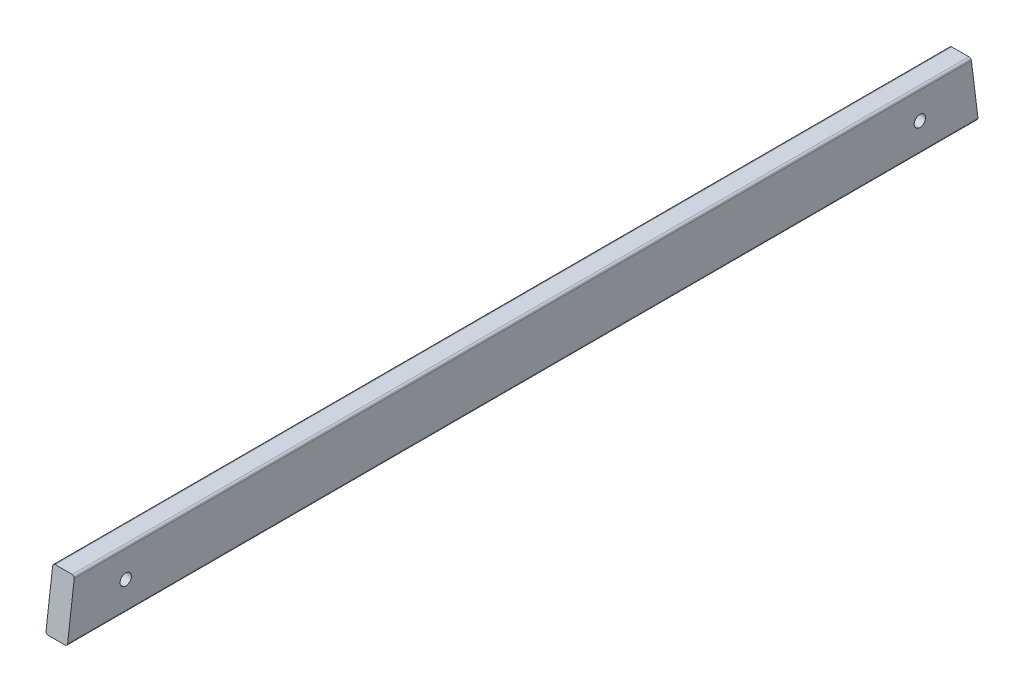
ISO-10303-21;
HEADER;
FILE_DESCRIPTION(('STEP AP214'),'2;1');
FILE_NAME('part.step','',(''),(''),'','','');
FILE_SCHEMA(('AUTOMOTIVE_DESIGN { 1 0 10303 214 1 1 1 1 }'));
ENDSEC;
DATA;
#1=APPLICATION_CONTEXT('core data for automotive mechanical design processes');
#2=APPLICATION_PROTOCOL_DEFINITION('international standard','automotive_design',2000,#1);
#3=PRODUCT_CONTEXT('',#1,'mechanical');
#4=PRODUCT('Part','Part','',(#3));
#5=PRODUCT_RELATED_PRODUCT_CATEGORY('part','',(#4));
#6=PRODUCT_DEFINITION_FORMATION('','',#4);
#7=PRODUCT_DEFINITION_CONTEXT('part definition',#1,'design');
#8=PRODUCT_DEFINITION('design','',#6,#7);
#9=PRODUCT_DEFINITION_SHAPE('','',#8);
#10=(LENGTH_UNIT() NAMED_UNIT(*) SI_UNIT(.MILLI.,.METRE.));
#11=(NAMED_UNIT(*) PLANE_ANGLE_UNIT() SI_UNIT($,.RADIAN.));
#12=(NAMED_UNIT(*) SI_UNIT($,.STERADIAN.) SOLID_ANGLE_UNIT());
#13=UNCERTAINTY_MEASURE_WITH_UNIT(LENGTH_MEASURE(1.E-05),#10,'distance_accuracy_value','');
#14=(GEOMETRIC_REPRESENTATION_CONTEXT(3) GLOBAL_UNCERTAINTY_ASSIGNED_CONTEXT((#13)) GLOBAL_UNIT_ASSIGNED_CONTEXT((#10,
#11,#12)) REPRESENTATION_CONTEXT('',''));
#15=CARTESIAN_POINT('',(0.,0.,0.));
#16=DIRECTION('',(0.,0.,1.));
#17=DIRECTION('',(1.,0.,0.));
#18=AXIS2_PLACEMENT_3D('',#15,#16,#17);
#19=CARTESIAN_POINT('',(4.7625,-12.7,210.));
#20=DIRECTION('',(-1.,0.,0.));
#21=DIRECTION('',(0.,0.,1.));
#22=AXIS2_PLACEMENT_3D('',#19,#20,#21);
#23=PLANE('',#22);
#24=CARTESIAN_POINT('',(4.7625,0.,-175.));
#25=DIRECTION('',(-1.,0.,0.));
#26=DIRECTION('',(0.,0.,1.));
#27=AXIS2_PLACEMENT_3D('',#24,#25,#26);
#28=CIRCLE('',#27,2.5);
#29=CARTESIAN_POINT('',(4.7625,0.,-172.5));
#30=VERTEX_POINT('',#29);
#31=EDGE_CURVE('E333',#30,#30,#28,.T.);
#32=ORIENTED_EDGE('',*,*,#31,.T.);
#33=EDGE_LOOP('',(#32));
#34=FACE_BOUND('',#33,.T.);
#35=CARTESIAN_POINT('',(4.7625,0.,175.));
#36=DIRECTION('',(-1.,0.,0.));
#37=DIRECTION('',(0.,0.,1.));
#38=AXIS2_PLACEMENT_3D('',#35,#36,#37);
#39=CIRCLE('',#38,2.5);
#40=CARTESIAN_POINT('',(4.7625,0.,177.5));
#41=VERTEX_POINT('',#40);
#42=EDGE_CURVE('E212',#41,#41,#39,.T.);
#43=ORIENTED_EDGE('',*,*,#42,.T.);
#44=EDGE_LOOP('',(#43));
#45=FACE_BOUND('',#44,.T.);
#46=DIRECTION('',(0.,-0.992433566496753,-0.122782800467067));
#47=VECTOR('',#46,1.);
#48=CARTESIAN_POINT('',(4.7625,-12.7,-200.73));
#49=LINE('',#48,#47);
#50=CARTESIAN_POINT('',(4.7625,11.7,-197.711258562251));
#51=VERTEX_POINT('',#50);
#52=CARTESIAN_POINT('',(4.7625,-11.7,-200.606281088617));
#53=VERTEX_POINT('',#52);
#54=EDGE_CURVE('E123',#51,#53,#49,.T.);
#55=ORIENTED_EDGE('',*,*,#54,.F.);
#56=DIRECTION('',(0.,0.,-1.));
#57=VECTOR('',#56,1.);
#58=CARTESIAN_POINT('',(4.7625,11.7,210.));
#59=LINE('',#58,#57);
#60=CARTESIAN_POINT('',(4.7625,11.7,197.711258562251));
#61=VERTEX_POINT('',#60);
#62=EDGE_CURVE('E178',#51,#61,#59,.F.);
#63=ORIENTED_EDGE('',*,*,#62,.T.);
#64=DIRECTION('',(0.,0.992433566496753,-0.122782800467067));
#65=VECTOR('',#64,1.);
#66=CARTESIAN_POINT('',(4.7625,642.333245071398,119.69));
#67=LINE('',#66,#65);
#68=CARTESIAN_POINT('',(4.7625,-11.7,200.606281088617));
#69=VERTEX_POINT('',#68);
#70=EDGE_CURVE('E199',#69,#61,#67,.T.);
#71=ORIENTED_EDGE('',*,*,#70,.F.);
#72=DIRECTION('',(0.,0.,-1.));
#73=VECTOR('',#72,1.);
#74=CARTESIAN_POINT('',(4.7625,-11.7,210.));
#75=LINE('',#74,#73);
#76=EDGE_CURVE('E182',#69,#53,#75,.T.);
#77=ORIENTED_EDGE('',*,*,#76,.T.);
#78=EDGE_LOOP('',(#55,#63,#71,#77));
#79=FACE_BOUND('',#78,.T.);
#80=ADVANCED_FACE('F41',(#34,#45,#79),#23,.F.);
#81=CARTESIAN_POINT('',(-4.7625,12.7,210.));
#82=DIRECTION('',(0.,-1.,0.));
#83=DIRECTION('',(0.,0.,-1.));
#84=AXIS2_PLACEMENT_3D('',#81,#82,#83);
#85=PLANE('',#84);
#86=DIRECTION('',(1.,0.,0.));
#87=VECTOR('',#86,1.);
#88=CARTESIAN_POINT('',(-4.7625,12.7,-197.587539650868));
#89=LINE('',#88,#87);
#90=CARTESIAN_POINT('',(-3.7625,12.7,-197.587539650868));
#91=VERTEX_POINT('',#90);
#92=CARTESIAN_POINT('',(3.7625,12.7,-197.587539650868));
#93=VERTEX_POINT('',#92);
#94=EDGE_CURVE('E163',#91,#93,#89,.T.);
#95=ORIENTED_EDGE('',*,*,#94,.F.);
#96=DIRECTION('',(0.,0.,-1.));
#97=VECTOR('',#96,1.);
#98=CARTESIAN_POINT('',(-3.7625,12.7,210.));
#99=LINE('',#98,#97);
#100=CARTESIAN_POINT('',(-3.7625,12.7,197.587539650868));
#101=VERTEX_POINT('',#100);
#102=EDGE_CURVE('E139',#91,#101,#99,.F.);
#103=ORIENTED_EDGE('',*,*,#102,.T.);
#104=DIRECTION('',(-1.,0.,0.));
#105=VECTOR('',#104,1.);
#106=CARTESIAN_POINT('',(-4.7625,12.7,197.587539650868));
#107=LINE('',#106,#105);
#108=CARTESIAN_POINT('',(3.7625,12.7,197.587539650868));
#109=VERTEX_POINT('',#108);
#110=EDGE_CURVE('E66',#109,#101,#107,.T.);
#111=ORIENTED_EDGE('',*,*,#110,.F.);
#112=DIRECTION('',(0.,0.,-1.));
#113=VECTOR('',#112,1.);
#114=CARTESIAN_POINT('',(3.7625,12.7,210.));
#115=LINE('',#114,#113);
#116=EDGE_CURVE('E146',#109,#93,#115,.T.);
#117=ORIENTED_EDGE('',*,*,#116,.T.);
#118=EDGE_LOOP('',(#95,#103,#111,#117));
#119=FACE_BOUND('',#118,.T.);
#120=ADVANCED_FACE('F161',(#119),#85,.F.);
#121=CARTESIAN_POINT('',(-4.7625,-12.7,210.));
#122=DIRECTION('',(1.,0.,0.));
#123=DIRECTION('',(0.,0.,-1.));
#124=AXIS2_PLACEMENT_3D('',#121,#122,#123);
#125=PLANE('',#124);
#126=CARTESIAN_POINT('',(-4.7625,0.,-175.));
#127=DIRECTION('',(-1.,0.,0.));
#128=DIRECTION('',(0.,0.,1.));
#129=AXIS2_PLACEMENT_3D('',#126,#127,#128);
#130=CIRCLE('',#129,2.5);
#131=CARTESIAN_POINT('',(-4.7625,0.,-172.5));
#132=VERTEX_POINT('',#131);
#133=EDGE_CURVE('E336',#132,#132,#130,.T.);
#134=ORIENTED_EDGE('',*,*,#133,.F.);
#135=EDGE_LOOP('',(#134));
#136=FACE_BOUND('',#135,.T.);
#137=CARTESIAN_POINT('',(-4.7625,0.,175.));
#138=DIRECTION('',(-1.,0.,0.));
#139=DIRECTION('',(0.,0.,1.));
#140=AXIS2_PLACEMENT_3D('',#137,#138,#139);
#141=CIRCLE('',#140,2.5);
#142=CARTESIAN_POINT('',(-4.7625,0.,177.5));
#143=VERTEX_POINT('',#142);
#144=EDGE_CURVE('E340',#143,#143,#141,.T.);
#145=ORIENTED_EDGE('',*,*,#144,.F.);
#146=EDGE_LOOP('',(#145));
#147=FACE_BOUND('',#146,.T.);
#148=DIRECTION('',(0.,-0.992433566496753,-0.122782800467067));
#149=VECTOR('',#148,1.);
#150=CARTESIAN_POINT('',(-4.7625,-12.7,-200.73));
#151=LINE('',#150,#149);
#152=CARTESIAN_POINT('',(-4.7625,11.7,-197.711258562251));
#153=VERTEX_POINT('',#152);
#154=CARTESIAN_POINT('',(-4.7625,-11.7,-200.606281088617));
#155=VERTEX_POINT('',#154);
#156=EDGE_CURVE('E56',#153,#155,#151,.T.);
#157=ORIENTED_EDGE('',*,*,#156,.T.);
#158=DIRECTION('',(0.,0.,-1.));
#159=VECTOR('',#158,1.);
#160=CARTESIAN_POINT('',(-4.7625,-11.7,210.));
#161=LINE('',#160,#159);
#162=CARTESIAN_POINT('',(-4.7625,-11.7,200.606281088617));
#163=VERTEX_POINT('',#162);
#164=EDGE_CURVE('E130',#155,#163,#161,.F.);
#165=ORIENTED_EDGE('',*,*,#164,.T.);
#166=DIRECTION('',(0.,0.992433566496753,-0.122782800467067));
#167=VECTOR('',#166,1.);
#168=CARTESIAN_POINT('',(-4.7625,642.333245071398,119.69));
#169=LINE('',#168,#167);
#170=CARTESIAN_POINT('',(-4.7625,11.7,197.711258562251));
#171=VERTEX_POINT('',#170);
#172=EDGE_CURVE('E113',#163,#171,#169,.T.);
#173=ORIENTED_EDGE('',*,*,#172,.T.);
#174=DIRECTION('',(0.,0.,-1.));
#175=VECTOR('',#174,1.);
#176=CARTESIAN_POINT('',(-4.7625,11.7,210.));
#177=LINE('',#176,#175);
#178=EDGE_CURVE('E140',#171,#153,#177,.T.);
#179=ORIENTED_EDGE('',*,*,#178,.T.);
#180=EDGE_LOOP('',(#157,#165,#173,#179));
#181=FACE_BOUND('',#180,.T.);
#182=ADVANCED_FACE('F137',(#136,#147,#181),#125,.F.);
#183=CARTESIAN_POINT('',(-4.7625,-12.7,210.));
#184=DIRECTION('',(0.,1.,0.));
#185=DIRECTION('',(0.,0.,1.));
#186=AXIS2_PLACEMENT_3D('',#183,#184,#185);
#187=PLANE('',#186);
#188=DIRECTION('',(-1.,0.,0.));
#189=VECTOR('',#188,1.);
#190=CARTESIAN_POINT('',(4.7625,-12.7,-200.73));
#191=LINE('',#190,#189);
#192=CARTESIAN_POINT('',(3.7625,-12.7,-200.73));
#193=VERTEX_POINT('',#192);
#194=CARTESIAN_POINT('',(-3.7625,-12.7,-200.73));
#195=VERTEX_POINT('',#194);
#196=EDGE_CURVE('E194',#193,#195,#191,.T.);
#197=ORIENTED_EDGE('',*,*,#196,.F.);
#198=DIRECTION('',(0.,0.,-1.));
#199=VECTOR('',#198,1.);
#200=CARTESIAN_POINT('',(3.7625,-12.7,210.));
#201=LINE('',#200,#199);
#202=CARTESIAN_POINT('',(3.7625,-12.7,200.73));
#203=VERTEX_POINT('',#202);
#204=EDGE_CURVE('E149',#193,#203,#201,.F.);
#205=ORIENTED_EDGE('',*,*,#204,.T.);
#206=DIRECTION('',(-1.,0.,0.));
#207=VECTOR('',#206,1.);
#208=CARTESIAN_POINT('',(4.7625,-12.7,200.73));
#209=LINE('',#208,#207);
#210=CARTESIAN_POINT('',(-3.7625,-12.7,200.73));
#211=VERTEX_POINT('',#210);
#212=EDGE_CURVE('E193',#203,#211,#209,.T.);
#213=ORIENTED_EDGE('',*,*,#212,.T.);
#214=DIRECTION('',(0.,0.,-1.));
#215=VECTOR('',#214,1.);
#216=CARTESIAN_POINT('',(-3.7625,-12.7,210.));
#217=LINE('',#216,#215);
#218=EDGE_CURVE('E132',#211,#195,#217,.T.);
#219=ORIENTED_EDGE('',*,*,#218,.T.);
#220=EDGE_LOOP('',(#197,#205,#213,#219));
#221=FACE_BOUND('',#220,.T.);
#222=ADVANCED_FACE('F192',(#221),#187,.F.);
#223=CARTESIAN_POINT('',(3.7625,-11.7,210.));
#224=DIRECTION('',(0.,0.,-1.));
#225=DIRECTION('',(-1.,0.,0.));
#226=AXIS2_PLACEMENT_3D('',#223,#224,#225);
#227=CYLINDRICAL_SURFACE('',#226,1.);
#228=ORIENTED_EDGE('',*,*,#204,.F.);
#229=CARTESIAN_POINT('',(3.7625,-11.7,-200.606281088617));
#230=DIRECTION('',(0.,0.122782800467067,-0.992433566496753));
#231=DIRECTION('',(0.,-0.992433566496753,-0.122782800467067));
#232=AXIS2_PLACEMENT_3D('',#229,#230,#231);
#233=ELLIPSE('',#232,1.00762412090711,1.);
#234=EDGE_CURVE('E174',#193,#53,#233,.F.);
#235=ORIENTED_EDGE('',*,*,#234,.T.);
#236=ORIENTED_EDGE('',*,*,#76,.F.);
#237=CARTESIAN_POINT('',(3.7625,-11.7,200.606281088617));
#238=DIRECTION('',(0.,0.122782800467067,0.992433566496753));
#239=DIRECTION('',(0.,0.992433566496753,-0.122782800467067));
#240=AXIS2_PLACEMENT_3D('',#237,#238,#239);
#241=ELLIPSE('',#240,1.00762412090711,1.);
#242=EDGE_CURVE('E134',#69,#203,#241,.F.);
#243=ORIENTED_EDGE('',*,*,#242,.T.);
#244=EDGE_LOOP('',(#228,#235,#236,#243));
#245=FACE_BOUND('',#244,.T.);
#246=ADVANCED_FACE('F196',(#245),#227,.T.);
#247=CARTESIAN_POINT('',(-3.7625,-11.7,210.));
#248=DIRECTION('',(0.,0.,-1.));
#249=DIRECTION('',(-1.,0.,0.));
#250=AXIS2_PLACEMENT_3D('',#247,#248,#249);
#251=CYLINDRICAL_SURFACE('',#250,1.);
#252=ORIENTED_EDGE('',*,*,#164,.F.);
#253=CARTESIAN_POINT('',(-3.7625,-11.7,-200.606281088617));
#254=DIRECTION('',(0.,0.122782800467067,-0.992433566496753));
#255=DIRECTION('',(0.,-0.992433566496753,-0.122782800467067));
#256=AXIS2_PLACEMENT_3D('',#253,#254,#255);
#257=ELLIPSE('',#256,1.00762412090711,1.);
#258=EDGE_CURVE('E167',#155,#195,#257,.F.);
#259=ORIENTED_EDGE('',*,*,#258,.T.);
#260=ORIENTED_EDGE('',*,*,#218,.F.);
#261=CARTESIAN_POINT('',(-3.7625,-11.7,200.606281088617));
#262=DIRECTION('',(0.,0.122782800467067,0.992433566496753));
#263=DIRECTION('',(0.,0.992433566496753,-0.122782800467067));
#264=AXIS2_PLACEMENT_3D('',#261,#262,#263);
#265=ELLIPSE('',#264,1.00762412090711,1.);
#266=EDGE_CURVE('E116',#211,#163,#265,.F.);
#267=ORIENTED_EDGE('',*,*,#266,.T.);
#268=EDGE_LOOP('',(#252,#259,#260,#267));
#269=FACE_BOUND('',#268,.T.);
#270=ADVANCED_FACE('F128',(#269),#251,.T.);
#271=CARTESIAN_POINT('',(3.7625,11.7,210.));
#272=DIRECTION('',(0.,0.,-1.));
#273=DIRECTION('',(-1.,0.,0.));
#274=AXIS2_PLACEMENT_3D('',#271,#272,#273);
#275=CYLINDRICAL_SURFACE('',#274,1.);
#276=ORIENTED_EDGE('',*,*,#62,.F.);
#277=CARTESIAN_POINT('',(3.7625,11.7,-197.711258562251));
#278=DIRECTION('',(0.,0.122782800467067,-0.992433566496753));
#279=DIRECTION('',(0.,-0.992433566496753,-0.122782800467067));
#280=AXIS2_PLACEMENT_3D('',#277,#278,#279);
#281=ELLIPSE('',#280,1.00762412090711,1.);
#282=EDGE_CURVE('E165',#51,#93,#281,.F.);
#283=ORIENTED_EDGE('',*,*,#282,.T.);
#284=ORIENTED_EDGE('',*,*,#116,.F.);
#285=CARTESIAN_POINT('',(3.7625,11.7,197.711258562251));
#286=DIRECTION('',(0.,0.122782800467067,0.992433566496753));
#287=DIRECTION('',(0.,0.992433566496753,-0.122782800467067));
#288=AXIS2_PLACEMENT_3D('',#285,#286,#287);
#289=ELLIPSE('',#288,1.00762412090711,1.);
#290=EDGE_CURVE('E135',#109,#61,#289,.F.);
#291=ORIENTED_EDGE('',*,*,#290,.T.);
#292=EDGE_LOOP('',(#276,#283,#284,#291));
#293=FACE_BOUND('',#292,.T.);
#294=ADVANCED_FACE('F219',(#293),#275,.T.);
#295=CARTESIAN_POINT('',(-3.7625,11.7,210.));
#296=DIRECTION('',(0.,0.,-1.));
#297=DIRECTION('',(-1.,0.,0.));
#298=AXIS2_PLACEMENT_3D('',#295,#296,#297);
#299=CYLINDRICAL_SURFACE('',#298,1.);
#300=ORIENTED_EDGE('',*,*,#102,.F.);
#301=CARTESIAN_POINT('',(-3.7625,11.7,-197.711258562251));
#302=DIRECTION('',(0.,0.122782800467067,-0.992433566496753));
#303=DIRECTION('',(0.,-0.992433566496753,-0.122782800467067));
#304=AXIS2_PLACEMENT_3D('',#301,#302,#303);
#305=ELLIPSE('',#304,1.00762412090711,1.);
#306=EDGE_CURVE('E12',#91,#153,#305,.F.);
#307=ORIENTED_EDGE('',*,*,#306,.T.);
#308=ORIENTED_EDGE('',*,*,#178,.F.);
#309=CARTESIAN_POINT('',(-3.7625,11.7,197.711258562251));
#310=DIRECTION('',(0.,0.122782800467067,0.992433566496753));
#311=DIRECTION('',(0.,0.992433566496753,-0.122782800467067));
#312=AXIS2_PLACEMENT_3D('',#309,#310,#311);
#313=ELLIPSE('',#312,1.00762412090711,1.);
#314=EDGE_CURVE('E49',#171,#101,#313,.F.);
#315=ORIENTED_EDGE('',*,*,#314,.T.);
#316=EDGE_LOOP('',(#300,#307,#308,#315));
#317=FACE_BOUND('',#316,.T.);
#318=ADVANCED_FACE('F43',(#317),#299,.T.);
#319=CARTESIAN_POINT('',(4.7625,642.333245071398,119.69));
#320=DIRECTION('',(0.,0.122782800467067,0.992433566496753));
#321=DIRECTION('',(0.,-0.992433566496753,0.122782800467067));
#322=AXIS2_PLACEMENT_3D('',#319,#320,#321);
#323=PLANE('',#322);
#324=ORIENTED_EDGE('',*,*,#70,.T.);
#325=ORIENTED_EDGE('',*,*,#290,.F.);
#326=ORIENTED_EDGE('',*,*,#110,.T.);
#327=ORIENTED_EDGE('',*,*,#314,.F.);
#328=ORIENTED_EDGE('',*,*,#172,.F.);
#329=ORIENTED_EDGE('',*,*,#266,.F.);
#330=ORIENTED_EDGE('',*,*,#212,.F.);
#331=ORIENTED_EDGE('',*,*,#242,.F.);
#332=EDGE_LOOP('',(#324,#325,#326,#327,#328,#329,#330,#331));
#333=FACE_BOUND('',#332,.T.);
#334=ADVANCED_FACE('F115',(#333),#323,.T.);
#335=CARTESIAN_POINT('',(4.7625,-12.7,-200.73));
#336=DIRECTION('',(0.,0.122782800467067,-0.992433566496753));
#337=DIRECTION('',(0.,0.992433566496753,0.122782800467067));
#338=AXIS2_PLACEMENT_3D('',#335,#336,#337);
#339=PLANE('',#338);
#340=ORIENTED_EDGE('',*,*,#196,.T.);
#341=ORIENTED_EDGE('',*,*,#258,.F.);
#342=ORIENTED_EDGE('',*,*,#156,.F.);
#343=ORIENTED_EDGE('',*,*,#306,.F.);
#344=ORIENTED_EDGE('',*,*,#94,.T.);
#345=ORIENTED_EDGE('',*,*,#282,.F.);
#346=ORIENTED_EDGE('',*,*,#54,.T.);
#347=ORIENTED_EDGE('',*,*,#234,.F.);
#348=EDGE_LOOP('',(#340,#341,#342,#343,#344,#345,#346,#347));
#349=FACE_BOUND('',#348,.T.);
#350=ADVANCED_FACE('F220',(#349),#339,.T.);
#351=CARTESIAN_POINT('',(-4.7625,0.,175.));
#352=DIRECTION('',(-1.,0.,0.));
#353=DIRECTION('',(0.,0.,1.));
#354=AXIS2_PLACEMENT_3D('',#351,#352,#353);
#355=CYLINDRICAL_SURFACE('',#354,2.5);
#356=ORIENTED_EDGE('',*,*,#42,.F.);
#357=EDGE_LOOP('',(#356));
#358=FACE_BOUND('',#357,.T.);
#359=ORIENTED_EDGE('',*,*,#144,.T.);
#360=EDGE_LOOP('',(#359));
#361=FACE_BOUND('',#360,.T.);
#362=ADVANCED_FACE('F222',(#358,#361),#355,.F.);
#363=CARTESIAN_POINT('',(-4.7625,0.,-175.));
#364=DIRECTION('',(-1.,0.,0.));
#365=DIRECTION('',(0.,0.,1.));
#366=AXIS2_PLACEMENT_3D('',#363,#364,#365);
#367=CYLINDRICAL_SURFACE('',#366,2.5);
#368=ORIENTED_EDGE('',*,*,#31,.F.);
#369=EDGE_LOOP('',(#368));
#370=FACE_BOUND('',#369,.T.);
#371=ORIENTED_EDGE('',*,*,#133,.T.);
#372=EDGE_LOOP('',(#371));
#373=FACE_BOUND('',#372,.T.);
#374=ADVANCED_FACE('F228',(#370,#373),#367,.F.);
#375=CLOSED_SHELL('',(#80,#120,#182,#222,#246,#270,#294,#318,#334,#350,#362,#374));
#376=MANIFOLD_SOLID_BREP('B2',#375);
#377=ADVANCED_BREP_SHAPE_REPRESENTATION('',(#18,#376),#14);
#378=SHAPE_DEFINITION_REPRESENTATION(#9,#377);
ENDSEC;
END-ISO-10303-21;
